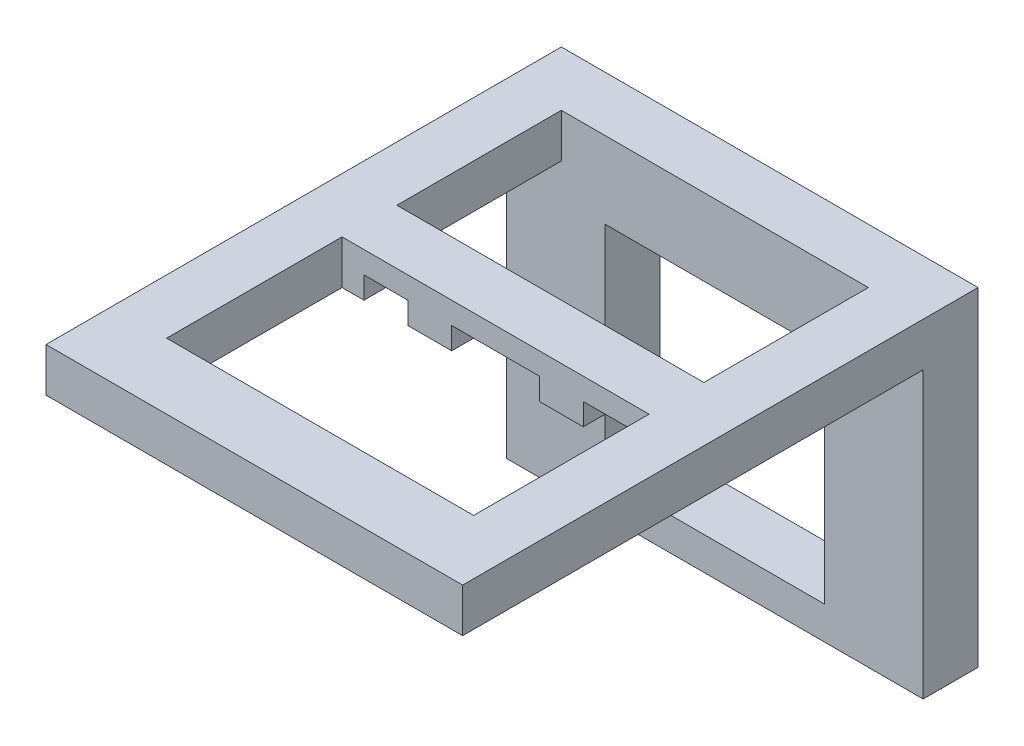
ISO-10303-21;
HEADER;
FILE_DESCRIPTION(('STEP AP214'),'2;1');
FILE_NAME('part.step','',(''),(''),'','','');
FILE_SCHEMA(('AUTOMOTIVE_DESIGN { 1 0 10303 214 1 1 1 1 }'));
ENDSEC;
DATA;
#1=APPLICATION_CONTEXT('core data for automotive mechanical design processes');
#2=APPLICATION_PROTOCOL_DEFINITION('international standard','automotive_design',2000,#1);
#3=PRODUCT_CONTEXT('',#1,'mechanical');
#4=PRODUCT('Part','Part','',(#3));
#5=PRODUCT_RELATED_PRODUCT_CATEGORY('part','',(#4));
#6=PRODUCT_DEFINITION_FORMATION('','',#4);
#7=PRODUCT_DEFINITION_CONTEXT('part definition',#1,'design');
#8=PRODUCT_DEFINITION('design','',#6,#7);
#9=PRODUCT_DEFINITION_SHAPE('','',#8);
#10=(LENGTH_UNIT() NAMED_UNIT(*) SI_UNIT(.MILLI.,.METRE.));
#11=(NAMED_UNIT(*) PLANE_ANGLE_UNIT() SI_UNIT($,.RADIAN.));
#12=(NAMED_UNIT(*) SI_UNIT($,.STERADIAN.) SOLID_ANGLE_UNIT());
#13=UNCERTAINTY_MEASURE_WITH_UNIT(LENGTH_MEASURE(1.E-05),#10,'distance_accuracy_value','');
#14=(GEOMETRIC_REPRESENTATION_CONTEXT(3) GLOBAL_UNCERTAINTY_ASSIGNED_CONTEXT((#13)) GLOBAL_UNIT_ASSIGNED_CONTEXT((#10,
#11,#12)) REPRESENTATION_CONTEXT('',''));
#15=CARTESIAN_POINT('',(0.,0.,0.));
#16=DIRECTION('',(0.,0.,1.));
#17=DIRECTION('',(1.,0.,0.));
#18=AXIS2_PLACEMENT_3D('',#15,#16,#17);
#19=CARTESIAN_POINT('',(0.,11.102908894462,12.5));
#20=DIRECTION('',(0.,0.,1.));
#21=DIRECTION('',(1.,0.,0.));
#22=AXIS2_PLACEMENT_3D('',#19,#20,#21);
#23=PLANE('',#22);
#24=DIRECTION('',(-1.,0.,0.));
#25=VECTOR('',#24,1.);
#26=CARTESIAN_POINT('',(-6.,10.102908894462,12.5));
#27=LINE('',#26,#25);
#28=CARTESIAN_POINT('',(-4.,10.102908894462,12.5));
#29=VERTEX_POINT('',#28);
#30=CARTESIAN_POINT('',(-6.,10.102908894462,12.5));
#31=VERTEX_POINT('',#30);
#32=EDGE_CURVE('E451',#29,#31,#27,.T.);
#33=ORIENTED_EDGE('',*,*,#32,.F.);
#34=DIRECTION('',(0.,1.,0.));
#35=VECTOR('',#34,1.);
#36=CARTESIAN_POINT('',(-4.,10.102908894462,12.5));
#37=LINE('',#36,#35);
#38=CARTESIAN_POINT('',(-4.,9.10290889446199,12.5));
#39=VERTEX_POINT('',#38);
#40=EDGE_CURVE('E908',#39,#29,#37,.T.);
#41=ORIENTED_EDGE('',*,*,#40,.F.);
#42=DIRECTION('',(-1.,0.,0.));
#43=VECTOR('',#42,1.);
#44=CARTESIAN_POINT('',(0.,9.10290889446198,12.5));
#45=LINE('',#44,#43);
#46=CARTESIAN_POINT('',(-2.,9.10290889446198,12.5));
#47=VERTEX_POINT('',#46);
#48=EDGE_CURVE('E262',#47,#39,#45,.T.);
#49=ORIENTED_EDGE('',*,*,#48,.F.);
#50=DIRECTION('',(0.,-1.,0.));
#51=VECTOR('',#50,1.);
#52=CARTESIAN_POINT('',(-2.,10.102908894462,12.5));
#53=LINE('',#52,#51);
#54=CARTESIAN_POINT('',(-2.,10.102908894462,12.5));
#55=VERTEX_POINT('',#54);
#56=EDGE_CURVE('E69',#55,#47,#53,.T.);
#57=ORIENTED_EDGE('',*,*,#56,.F.);
#58=DIRECTION('',(-1.,0.,0.));
#59=VECTOR('',#58,1.);
#60=CARTESIAN_POINT('',(-2.,10.102908894462,12.5));
#61=LINE('',#60,#59);
#62=CARTESIAN_POINT('',(2.,10.102908894462,12.5));
#63=VERTEX_POINT('',#62);
#64=EDGE_CURVE('E472',#63,#55,#61,.T.);
#65=ORIENTED_EDGE('',*,*,#64,.F.);
#66=DIRECTION('',(0.,1.,0.));
#67=VECTOR('',#66,1.);
#68=CARTESIAN_POINT('',(2.,10.102908894462,12.5));
#69=LINE('',#68,#67);
#70=CARTESIAN_POINT('',(2.,9.10290889446199,12.5));
#71=VERTEX_POINT('',#70);
#72=EDGE_CURVE('E511',#71,#63,#69,.T.);
#73=ORIENTED_EDGE('',*,*,#72,.F.);
#74=CARTESIAN_POINT('',(4.,9.10290889446198,12.5));
#75=VERTEX_POINT('',#74);
#76=EDGE_CURVE('E294',#75,#71,#45,.T.);
#77=ORIENTED_EDGE('',*,*,#76,.F.);
#78=DIRECTION('',(0.,-1.,0.));
#79=VECTOR('',#78,1.);
#80=CARTESIAN_POINT('',(4.,10.102908894462,12.5));
#81=LINE('',#80,#79);
#82=CARTESIAN_POINT('',(4.,10.102908894462,12.5));
#83=VERTEX_POINT('',#82);
#84=EDGE_CURVE('E480',#83,#75,#81,.T.);
#85=ORIENTED_EDGE('',*,*,#84,.F.);
#86=DIRECTION('',(-1.,0.,0.));
#87=VECTOR('',#86,1.);
#88=CARTESIAN_POINT('',(4.,10.102908894462,12.5));
#89=LINE('',#88,#87);
#90=CARTESIAN_POINT('',(6.,10.102908894462,12.5));
#91=VERTEX_POINT('',#90);
#92=EDGE_CURVE('E254',#91,#83,#89,.T.);
#93=ORIENTED_EDGE('',*,*,#92,.F.);
#94=DIRECTION('',(0.,1.,0.));
#95=VECTOR('',#94,1.);
#96=CARTESIAN_POINT('',(6.,10.102908894462,12.5));
#97=LINE('',#96,#95);
#98=CARTESIAN_POINT('',(6.,9.10290889446199,12.5));
#99=VERTEX_POINT('',#98);
#100=EDGE_CURVE('E476',#99,#91,#97,.T.);
#101=ORIENTED_EDGE('',*,*,#100,.F.);
#102=CARTESIAN_POINT('',(7.,9.10290889446198,12.5));
#103=VERTEX_POINT('',#102);
#104=EDGE_CURVE('E289',#103,#99,#45,.T.);
#105=ORIENTED_EDGE('',*,*,#104,.F.);
#106=DIRECTION('',(0.,-1.,0.));
#107=VECTOR('',#106,1.);
#108=CARTESIAN_POINT('',(7.,11.102908894462,12.5));
#109=LINE('',#108,#107);
#110=CARTESIAN_POINT('',(7.,11.102908894462,12.5));
#111=VERTEX_POINT('',#110);
#112=EDGE_CURVE('E331',#111,#103,#109,.T.);
#113=ORIENTED_EDGE('',*,*,#112,.F.);
#114=DIRECTION('',(-1.,0.,0.));
#115=VECTOR('',#114,1.);
#116=CARTESIAN_POINT('',(0.,11.102908894462,12.5));
#117=LINE('',#116,#115);
#118=CARTESIAN_POINT('',(-7.,11.102908894462,12.5));
#119=VERTEX_POINT('',#118);
#120=EDGE_CURVE('E554',#111,#119,#117,.T.);
#121=ORIENTED_EDGE('',*,*,#120,.T.);
#122=DIRECTION('',(0.,-1.,0.));
#123=VECTOR('',#122,1.);
#124=CARTESIAN_POINT('',(-7.,11.102908894462,12.5));
#125=LINE('',#124,#123);
#126=CARTESIAN_POINT('',(-7.,9.10290889446198,12.5));
#127=VERTEX_POINT('',#126);
#128=EDGE_CURVE('E318',#119,#127,#125,.T.);
#129=ORIENTED_EDGE('',*,*,#128,.T.);
#130=CARTESIAN_POINT('',(-6.,9.10290889446198,12.5));
#131=VERTEX_POINT('',#130);
#132=EDGE_CURVE('E288',#131,#127,#45,.T.);
#133=ORIENTED_EDGE('',*,*,#132,.F.);
#134=DIRECTION('',(0.,-1.,0.));
#135=VECTOR('',#134,1.);
#136=CARTESIAN_POINT('',(-6.,10.102908894462,12.5));
#137=LINE('',#136,#135);
#138=EDGE_CURVE('E61',#31,#131,#137,.T.);
#139=ORIENTED_EDGE('',*,*,#138,.F.);
#140=EDGE_LOOP('',(#33,#41,#49,#57,#65,#73,#77,#85,#93,#101,#105,#113,#121,#129,#133,#139));
#141=FACE_BOUND('',#140,.T.);
#142=ADVANCED_FACE('F43',(#141),#23,.T.);
#143=CARTESIAN_POINT('',(0.,11.102908894462,10.));
#144=DIRECTION('',(0.,0.,1.));
#145=DIRECTION('',(1.,0.,0.));
#146=AXIS2_PLACEMENT_3D('',#143,#144,#145);
#147=PLANE('',#146);
#148=DIRECTION('',(0.,1.,0.));
#149=VECTOR('',#148,1.);
#150=CARTESIAN_POINT('',(-4.,10.102908894462,10.));
#151=LINE('',#150,#149);
#152=CARTESIAN_POINT('',(-4.,9.10290889446198,10.));
#153=VERTEX_POINT('',#152);
#154=CARTESIAN_POINT('',(-4.,10.102908894462,10.));
#155=VERTEX_POINT('',#154);
#156=EDGE_CURVE('E242',#153,#155,#151,.T.);
#157=ORIENTED_EDGE('',*,*,#156,.T.);
#158=DIRECTION('',(-1.,0.,0.));
#159=VECTOR('',#158,1.);
#160=CARTESIAN_POINT('',(-6.,10.102908894462,10.));
#161=LINE('',#160,#159);
#162=CARTESIAN_POINT('',(-6.,10.102908894462,10.));
#163=VERTEX_POINT('',#162);
#164=EDGE_CURVE('E458',#155,#163,#161,.T.);
#165=ORIENTED_EDGE('',*,*,#164,.T.);
#166=DIRECTION('',(0.,-1.,0.));
#167=VECTOR('',#166,1.);
#168=CARTESIAN_POINT('',(-6.,10.102908894462,10.));
#169=LINE('',#168,#167);
#170=CARTESIAN_POINT('',(-6.,9.10290889446198,10.));
#171=VERTEX_POINT('',#170);
#172=EDGE_CURVE('E253',#163,#171,#169,.T.);
#173=ORIENTED_EDGE('',*,*,#172,.T.);
#174=DIRECTION('',(-1.,0.,0.));
#175=VECTOR('',#174,1.);
#176=CARTESIAN_POINT('',(0.,9.10290889446198,10.));
#177=LINE('',#176,#175);
#178=CARTESIAN_POINT('',(-7.,9.10290889446198,10.));
#179=VERTEX_POINT('',#178);
#180=EDGE_CURVE('E272',#171,#179,#177,.T.);
#181=ORIENTED_EDGE('',*,*,#180,.T.);
#182=DIRECTION('',(0.,-1.,0.));
#183=VECTOR('',#182,1.);
#184=CARTESIAN_POINT('',(-7.,11.102908894462,10.));
#185=LINE('',#184,#183);
#186=CARTESIAN_POINT('',(-7.,11.102908894462,10.));
#187=VERTEX_POINT('',#186);
#188=EDGE_CURVE('E337',#187,#179,#185,.T.);
#189=ORIENTED_EDGE('',*,*,#188,.F.);
#190=DIRECTION('',(-1.,0.,0.));
#191=VECTOR('',#190,1.);
#192=CARTESIAN_POINT('',(0.,11.102908894462,10.));
#193=LINE('',#192,#191);
#194=CARTESIAN_POINT('',(7.,11.102908894462,10.));
#195=VERTEX_POINT('',#194);
#196=EDGE_CURVE('E547',#195,#187,#193,.T.);
#197=ORIENTED_EDGE('',*,*,#196,.F.);
#198=DIRECTION('',(0.,-1.,0.));
#199=VECTOR('',#198,1.);
#200=CARTESIAN_POINT('',(7.,11.102908894462,10.));
#201=LINE('',#200,#199);
#202=CARTESIAN_POINT('',(7.,9.10290889446198,10.));
#203=VERTEX_POINT('',#202);
#204=EDGE_CURVE('E341',#195,#203,#201,.T.);
#205=ORIENTED_EDGE('',*,*,#204,.T.);
#206=CARTESIAN_POINT('',(6.,9.10290889446198,10.));
#207=VERTEX_POINT('',#206);
#208=EDGE_CURVE('E277',#203,#207,#177,.T.);
#209=ORIENTED_EDGE('',*,*,#208,.T.);
#210=DIRECTION('',(0.,1.,0.));
#211=VECTOR('',#210,1.);
#212=CARTESIAN_POINT('',(6.,10.102908894462,10.));
#213=LINE('',#212,#211);
#214=CARTESIAN_POINT('',(6.,10.102908894462,10.));
#215=VERTEX_POINT('',#214);
#216=EDGE_CURVE('E467',#207,#215,#213,.T.);
#217=ORIENTED_EDGE('',*,*,#216,.T.);
#218=DIRECTION('',(-1.,0.,0.));
#219=VECTOR('',#218,1.);
#220=CARTESIAN_POINT('',(4.,10.102908894462,10.));
#221=LINE('',#220,#219);
#222=CARTESIAN_POINT('',(4.,10.102908894462,10.));
#223=VERTEX_POINT('',#222);
#224=EDGE_CURVE('E498',#215,#223,#221,.T.);
#225=ORIENTED_EDGE('',*,*,#224,.T.);
#226=DIRECTION('',(0.,-1.,0.));
#227=VECTOR('',#226,1.);
#228=CARTESIAN_POINT('',(4.,10.102908894462,10.));
#229=LINE('',#228,#227);
#230=CARTESIAN_POINT('',(4.,9.10290889446198,10.));
#231=VERTEX_POINT('',#230);
#232=EDGE_CURVE('E471',#223,#231,#229,.T.);
#233=ORIENTED_EDGE('',*,*,#232,.T.);
#234=CARTESIAN_POINT('',(2.,9.10290889446198,10.));
#235=VERTEX_POINT('',#234);
#236=EDGE_CURVE('E271',#231,#235,#177,.T.);
#237=ORIENTED_EDGE('',*,*,#236,.T.);
#238=DIRECTION('',(0.,1.,0.));
#239=VECTOR('',#238,1.);
#240=CARTESIAN_POINT('',(2.,10.102908894462,10.));
#241=LINE('',#240,#239);
#242=CARTESIAN_POINT('',(2.,10.102908894462,10.));
#243=VERTEX_POINT('',#242);
#244=EDGE_CURVE('E505',#235,#243,#241,.T.);
#245=ORIENTED_EDGE('',*,*,#244,.T.);
#246=DIRECTION('',(-1.,0.,0.));
#247=VECTOR('',#246,1.);
#248=CARTESIAN_POINT('',(-2.,10.102908894462,10.));
#249=LINE('',#248,#247);
#250=CARTESIAN_POINT('',(-2.,10.102908894462,10.));
#251=VERTEX_POINT('',#250);
#252=EDGE_CURVE('E532',#243,#251,#249,.T.);
#253=ORIENTED_EDGE('',*,*,#252,.T.);
#254=DIRECTION('',(0.,-1.,0.));
#255=VECTOR('',#254,1.);
#256=CARTESIAN_POINT('',(-2.,10.102908894462,10.));
#257=LINE('',#256,#255);
#258=CARTESIAN_POINT('',(-2.,9.10290889446198,10.));
#259=VERTEX_POINT('',#258);
#260=EDGE_CURVE('E269',#251,#259,#257,.T.);
#261=ORIENTED_EDGE('',*,*,#260,.T.);
#262=EDGE_CURVE('E260',#259,#153,#177,.T.);
#263=ORIENTED_EDGE('',*,*,#262,.T.);
#264=EDGE_LOOP('',(#157,#165,#173,#181,#189,#197,#205,#209,#217,#225,#233,#237,#245,#253,#261,#263));
#265=FACE_BOUND('',#264,.T.);
#266=ADVANCED_FACE('F267',(#265),#147,.F.);
#267=CARTESIAN_POINT('',(0.,9.10290889446198,0.));
#268=DIRECTION('',(0.,1.,0.));
#269=DIRECTION('',(-1.,0.,0.));
#270=AXIS2_PLACEMENT_3D('',#267,#268,#269);
#271=PLANE('',#270);
#272=DIRECTION('',(0.,0.,-1.));
#273=VECTOR('',#272,1.);
#274=CARTESIAN_POINT('',(-4.,9.10290889446199,23.501));
#275=LINE('',#274,#273);
#276=EDGE_CURVE('E246',#39,#153,#275,.T.);
#277=ORIENTED_EDGE('',*,*,#276,.T.);
#278=ORIENTED_EDGE('',*,*,#262,.F.);
#279=DIRECTION('',(0.,0.,-1.));
#280=VECTOR('',#279,1.);
#281=CARTESIAN_POINT('',(-2.,9.10290889446199,23.501));
#282=LINE('',#281,#280);
#283=EDGE_CURVE('E529',#47,#259,#282,.T.);
#284=ORIENTED_EDGE('',*,*,#283,.F.);
#285=ORIENTED_EDGE('',*,*,#48,.T.);
#286=EDGE_LOOP('',(#277,#278,#284,#285));
#287=FACE_BOUND('',#286,.T.);
#288=ADVANCED_FACE('F259',(#287),#271,.F.);
#289=DIRECTION('',(0.,0.,-1.));
#290=VECTOR('',#289,1.);
#291=CARTESIAN_POINT('',(-6.,9.10290889446199,23.501));
#292=LINE('',#291,#290);
#293=EDGE_CURVE('E264',#131,#171,#292,.T.);
#294=ORIENTED_EDGE('',*,*,#293,.F.);
#295=ORIENTED_EDGE('',*,*,#132,.T.);
#296=DIRECTION('',(0.,0.,1.));
#297=VECTOR('',#296,1.);
#298=CARTESIAN_POINT('',(-7.,9.10290889446198,0.));
#299=LINE('',#298,#297);
#300=CARTESIAN_POINT('',(-7.,9.10290889446198,20.5));
#301=VERTEX_POINT('',#300);
#302=EDGE_CURVE('E283',#127,#301,#299,.T.);
#303=ORIENTED_EDGE('',*,*,#302,.T.);
#304=DIRECTION('',(-1.,0.,0.));
#305=VECTOR('',#304,1.);
#306=CARTESIAN_POINT('',(0.,9.10290889446198,20.5));
#307=LINE('',#306,#305);
#308=CARTESIAN_POINT('',(7.,9.10290889446198,20.5));
#309=VERTEX_POINT('',#308);
#310=EDGE_CURVE('E298',#309,#301,#307,.T.);
#311=ORIENTED_EDGE('',*,*,#310,.F.);
#312=DIRECTION('',(0.,0.,1.));
#313=VECTOR('',#312,1.);
#314=CARTESIAN_POINT('',(7.,9.10290889446198,0.));
#315=LINE('',#314,#313);
#316=EDGE_CURVE('E293',#103,#309,#315,.T.);
#317=ORIENTED_EDGE('',*,*,#316,.F.);
#318=ORIENTED_EDGE('',*,*,#104,.T.);
#319=DIRECTION('',(0.,0.,-1.));
#320=VECTOR('',#319,1.);
#321=CARTESIAN_POINT('',(6.,9.10290889446199,23.501));
#322=LINE('',#321,#320);
#323=EDGE_CURVE('E491',#99,#207,#322,.T.);
#324=ORIENTED_EDGE('',*,*,#323,.T.);
#325=ORIENTED_EDGE('',*,*,#208,.F.);
#326=DIRECTION('',(0.,0.,1.));
#327=VECTOR('',#326,1.);
#328=CARTESIAN_POINT('',(7.,9.10290889446198,0.));
#329=LINE('',#328,#327);
#330=CARTESIAN_POINT('',(7.,9.10290889446198,2.5));
#331=VERTEX_POINT('',#330);
#332=EDGE_CURVE('E278',#331,#203,#329,.T.);
#333=ORIENTED_EDGE('',*,*,#332,.F.);
#334=DIRECTION('',(-1.,0.,0.));
#335=VECTOR('',#334,1.);
#336=CARTESIAN_POINT('',(0.,9.10290889446198,2.5));
#337=LINE('',#336,#335);
#338=CARTESIAN_POINT('',(9.5,9.10290889446198,2.5));
#339=VERTEX_POINT('',#338);
#340=EDGE_CURVE('E358',#339,#331,#337,.T.);
#341=ORIENTED_EDGE('',*,*,#340,.F.);
#342=DIRECTION('',(0.,0.,-1.));
#343=VECTOR('',#342,1.);
#344=CARTESIAN_POINT('',(9.5,9.10290889446198,0.));
#345=LINE('',#344,#343);
#346=CARTESIAN_POINT('',(9.5,9.10290889446198,23.5));
#347=VERTEX_POINT('',#346);
#348=EDGE_CURVE('E309',#347,#339,#345,.T.);
#349=ORIENTED_EDGE('',*,*,#348,.F.);
#350=DIRECTION('',(-1.,0.,0.));
#351=VECTOR('',#350,1.);
#352=CARTESIAN_POINT('',(0.,9.10290889446198,23.5));
#353=LINE('',#352,#351);
#354=CARTESIAN_POINT('',(-9.5,9.10290889446198,23.5));
#355=VERTEX_POINT('',#354);
#356=EDGE_CURVE('E305',#347,#355,#353,.T.);
#357=ORIENTED_EDGE('',*,*,#356,.T.);
#358=DIRECTION('',(0.,0.,1.));
#359=VECTOR('',#358,1.);
#360=CARTESIAN_POINT('',(-9.5,9.10290889446198,0.));
#361=LINE('',#360,#359);
#362=CARTESIAN_POINT('',(-9.5,9.10290889446198,2.5));
#363=VERTEX_POINT('',#362);
#364=EDGE_CURVE('E302',#363,#355,#361,.T.);
#365=ORIENTED_EDGE('',*,*,#364,.F.);
#366=CARTESIAN_POINT('',(-7.,9.10290889446198,2.5));
#367=VERTEX_POINT('',#366);
#368=EDGE_CURVE('E356',#367,#363,#337,.T.);
#369=ORIENTED_EDGE('',*,*,#368,.F.);
#370=DIRECTION('',(0.,0.,1.));
#371=VECTOR('',#370,1.);
#372=CARTESIAN_POINT('',(-7.,9.10290889446198,0.));
#373=LINE('',#372,#371);
#374=EDGE_CURVE('E448',#367,#179,#373,.T.);
#375=ORIENTED_EDGE('',*,*,#374,.T.);
#376=ORIENTED_EDGE('',*,*,#180,.F.);
#377=EDGE_LOOP('',(#294,#295,#303,#311,#317,#318,#324,#325,#333,#341,#349,#357,#365,#369,#375,#376));
#378=FACE_BOUND('',#377,.T.);
#379=ADVANCED_FACE('F572',(#378),#271,.F.);
#380=DIRECTION('',(0.,0.,-1.));
#381=VECTOR('',#380,1.);
#382=CARTESIAN_POINT('',(4.,9.10290889446199,23.501));
#383=LINE('',#382,#381);
#384=EDGE_CURVE('E495',#75,#231,#383,.T.);
#385=ORIENTED_EDGE('',*,*,#384,.F.);
#386=ORIENTED_EDGE('',*,*,#76,.T.);
#387=DIRECTION('',(0.,0.,-1.));
#388=VECTOR('',#387,1.);
#389=CARTESIAN_POINT('',(2.,9.10290889446199,23.501));
#390=LINE('',#389,#388);
#391=EDGE_CURVE('E525',#71,#235,#390,.T.);
#392=ORIENTED_EDGE('',*,*,#391,.T.);
#393=ORIENTED_EDGE('',*,*,#236,.F.);
#394=EDGE_LOOP('',(#385,#386,#392,#393));
#395=FACE_BOUND('',#394,.T.);
#396=ADVANCED_FACE('F600',(#395),#271,.F.);
#397=CARTESIAN_POINT('',(0.,7.60290889446198,2.5));
#398=DIRECTION('',(0.,1.,0.));
#399=DIRECTION('',(0.,0.,1.));
#400=AXIS2_PLACEMENT_3D('',#397,#398,#399);
#401=PLANE('',#400);
#402=DIRECTION('',(1.,0.,0.));
#403=VECTOR('',#402,1.);
#404=CARTESIAN_POINT('',(0.,7.60290889446198,0.));
#405=LINE('',#404,#403);
#406=CARTESIAN_POINT('',(-5.,7.60290889446198,0.));
#407=VERTEX_POINT('',#406);
#408=CARTESIAN_POINT('',(5.,7.60290889446198,0.));
#409=VERTEX_POINT('',#408);
#410=EDGE_CURVE('E394',#407,#409,#405,.T.);
#411=ORIENTED_EDGE('',*,*,#410,.T.);
#412=DIRECTION('',(0.,0.,-1.));
#413=VECTOR('',#412,1.);
#414=CARTESIAN_POINT('',(5.,7.60290889446198,2.5));
#415=LINE('',#414,#413);
#416=CARTESIAN_POINT('',(5.,7.60290889446198,2.5));
#417=VERTEX_POINT('',#416);
#418=EDGE_CURVE('E11',#417,#409,#415,.T.);
#419=ORIENTED_EDGE('',*,*,#418,.F.);
#420=DIRECTION('',(1.,0.,0.));
#421=VECTOR('',#420,1.);
#422=CARTESIAN_POINT('',(0.,7.60290889446198,2.5));
#423=LINE('',#422,#421);
#424=CARTESIAN_POINT('',(-5.,7.60290889446198,2.5));
#425=VERTEX_POINT('',#424);
#426=EDGE_CURVE('E369',#425,#417,#423,.T.);
#427=ORIENTED_EDGE('',*,*,#426,.F.);
#428=DIRECTION('',(0.,0.,-1.));
#429=VECTOR('',#428,1.);
#430=CARTESIAN_POINT('',(-5.,7.60290889446198,2.5));
#431=LINE('',#430,#429);
#432=EDGE_CURVE('E407',#425,#407,#431,.T.);
#433=ORIENTED_EDGE('',*,*,#432,.T.);
#434=EDGE_LOOP('',(#411,#419,#427,#433));
#435=FACE_BOUND('',#434,.T.);
#436=ADVANCED_FACE('F668',(#435),#401,.F.);
#437=CARTESIAN_POINT('',(5.,0.,2.5));
#438=DIRECTION('',(-1.,0.,0.));
#439=DIRECTION('',(0.,0.,1.));
#440=AXIS2_PLACEMENT_3D('',#437,#438,#439);
#441=PLANE('',#440);
#442=DIRECTION('',(0.,1.,0.));
#443=VECTOR('',#442,1.);
#444=CARTESIAN_POINT('',(5.,0.,0.));
#445=LINE('',#444,#443);
#446=CARTESIAN_POINT('',(5.,-2.39709110553801,0.));
#447=VERTEX_POINT('',#446);
#448=EDGE_CURVE('E398',#447,#409,#445,.T.);
#449=ORIENTED_EDGE('',*,*,#448,.F.);
#450=DIRECTION('',(0.,0.,-1.));
#451=VECTOR('',#450,1.);
#452=CARTESIAN_POINT('',(5.,-2.39709110553801,2.5));
#453=LINE('',#452,#451);
#454=CARTESIAN_POINT('',(5.,-2.39709110553801,2.5));
#455=VERTEX_POINT('',#454);
#456=EDGE_CURVE('E53',#455,#447,#453,.T.);
#457=ORIENTED_EDGE('',*,*,#456,.F.);
#458=DIRECTION('',(0.,1.,0.));
#459=VECTOR('',#458,1.);
#460=CARTESIAN_POINT('',(5.,0.,2.5));
#461=LINE('',#460,#459);
#462=EDGE_CURVE('E372',#455,#417,#461,.T.);
#463=ORIENTED_EDGE('',*,*,#462,.T.);
#464=ORIENTED_EDGE('',*,*,#418,.T.);
#465=EDGE_LOOP('',(#449,#457,#463,#464));
#466=FACE_BOUND('',#465,.T.);
#467=ADVANCED_FACE('F664',(#466),#441,.T.);
#468=CARTESIAN_POINT('',(0.,-2.39709110553801,2.5));
#469=DIRECTION('',(0.,-1.,0.));
#470=DIRECTION('',(1.,0.,0.));
#471=AXIS2_PLACEMENT_3D('',#468,#469,#470);
#472=PLANE('',#471);
#473=DIRECTION('',(-1.,0.,0.));
#474=VECTOR('',#473,1.);
#475=CARTESIAN_POINT('',(0.,-2.39709110553801,0.));
#476=LINE('',#475,#474);
#477=CARTESIAN_POINT('',(-5.,-2.39709110553802,0.));
#478=VERTEX_POINT('',#477);
#479=EDGE_CURVE('E402',#447,#478,#476,.T.);
#480=ORIENTED_EDGE('',*,*,#479,.T.);
#481=DIRECTION('',(0.,0.,-1.));
#482=VECTOR('',#481,1.);
#483=CARTESIAN_POINT('',(-5.,-2.39709110553802,2.5));
#484=LINE('',#483,#482);
#485=CARTESIAN_POINT('',(-5.,-2.39709110553802,2.5));
#486=VERTEX_POINT('',#485);
#487=EDGE_CURVE('E411',#486,#478,#484,.T.);
#488=ORIENTED_EDGE('',*,*,#487,.F.);
#489=DIRECTION('',(-1.,0.,0.));
#490=VECTOR('',#489,1.);
#491=CARTESIAN_POINT('',(0.,-2.39709110553801,2.5));
#492=LINE('',#491,#490);
#493=EDGE_CURVE('E376',#455,#486,#492,.T.);
#494=ORIENTED_EDGE('',*,*,#493,.F.);
#495=ORIENTED_EDGE('',*,*,#456,.T.);
#496=EDGE_LOOP('',(#480,#488,#494,#495));
#497=FACE_BOUND('',#496,.T.);
#498=ADVANCED_FACE('F661',(#497),#472,.F.);
#499=CARTESIAN_POINT('',(9.5,0.,2.5));
#500=DIRECTION('',(1.,0.,0.));
#501=DIRECTION('',(0.,1.,0.));
#502=AXIS2_PLACEMENT_3D('',#499,#500,#501);
#503=PLANE('',#502);
#504=DIRECTION('',(0.,-1.,0.));
#505=VECTOR('',#504,1.);
#506=CARTESIAN_POINT('',(9.5,0.,0.));
#507=LINE('',#506,#505);
#508=CARTESIAN_POINT('',(9.5,11.102908894462,0.));
#509=VERTEX_POINT('',#508);
#510=CARTESIAN_POINT('',(9.5,-3.89709110553801,0.));
#511=VERTEX_POINT('',#510);
#512=EDGE_CURVE('E322',#509,#511,#507,.T.);
#513=ORIENTED_EDGE('',*,*,#512,.F.);
#514=DIRECTION('',(0.,0.,-1.));
#515=VECTOR('',#514,1.);
#516=CARTESIAN_POINT('',(9.5,11.102908894462,0.));
#517=LINE('',#516,#515);
#518=CARTESIAN_POINT('',(9.5,11.102908894462,23.5));
#519=VERTEX_POINT('',#518);
#520=EDGE_CURVE('E342',#519,#509,#517,.T.);
#521=ORIENTED_EDGE('',*,*,#520,.F.);
#522=DIRECTION('',(0.,-1.,0.));
#523=VECTOR('',#522,1.);
#524=CARTESIAN_POINT('',(9.5,11.102908894462,23.5));
#525=LINE('',#524,#523);
#526=EDGE_CURVE('E314',#519,#347,#525,.T.);
#527=ORIENTED_EDGE('',*,*,#526,.T.);
#528=ORIENTED_EDGE('',*,*,#348,.T.);
#529=DIRECTION('',(0.,-1.,0.));
#530=VECTOR('',#529,1.);
#531=CARTESIAN_POINT('',(9.5,0.,2.5));
#532=LINE('',#531,#530);
#533=CARTESIAN_POINT('',(9.5,-3.89709110553801,2.5));
#534=VERTEX_POINT('',#533);
#535=EDGE_CURVE('E352',#339,#534,#532,.T.);
#536=ORIENTED_EDGE('',*,*,#535,.T.);
#537=DIRECTION('',(0.,0.,-1.));
#538=VECTOR('',#537,1.);
#539=CARTESIAN_POINT('',(9.5,-3.89709110553801,2.5));
#540=LINE('',#539,#538);
#541=EDGE_CURVE('E382',#534,#511,#540,.T.);
#542=ORIENTED_EDGE('',*,*,#541,.T.);
#543=EDGE_LOOP('',(#513,#521,#527,#528,#536,#542));
#544=FACE_BOUND('',#543,.T.);
#545=ADVANCED_FACE('F45',(#544),#503,.T.);
#546=CARTESIAN_POINT('',(-9.5,0.,2.5));
#547=DIRECTION('',(1.,0.,0.));
#548=DIRECTION('',(0.,1.,0.));
#549=AXIS2_PLACEMENT_3D('',#546,#547,#548);
#550=PLANE('',#549);
#551=DIRECTION('',(0.,-1.,0.));
#552=VECTOR('',#551,1.);
#553=CARTESIAN_POINT('',(-9.5,0.,0.));
#554=LINE('',#553,#552);
#555=CARTESIAN_POINT('',(-9.5,11.102908894462,0.));
#556=VERTEX_POINT('',#555);
#557=CARTESIAN_POINT('',(-9.5,-3.89709110553802,0.));
#558=VERTEX_POINT('',#557);
#559=EDGE_CURVE('E386',#556,#558,#554,.T.);
#560=ORIENTED_EDGE('',*,*,#559,.T.);
#561=DIRECTION('',(0.,0.,-1.));
#562=VECTOR('',#561,1.);
#563=CARTESIAN_POINT('',(-9.5,-3.89709110553802,2.5));
#564=LINE('',#563,#562);
#565=CARTESIAN_POINT('',(-9.5,-3.89709110553802,2.5));
#566=VERTEX_POINT('',#565);
#567=EDGE_CURVE('E47',#566,#558,#564,.T.);
#568=ORIENTED_EDGE('',*,*,#567,.F.);
#569=DIRECTION('',(0.,-1.,0.));
#570=VECTOR('',#569,1.);
#571=CARTESIAN_POINT('',(-9.5,0.,2.5));
#572=LINE('',#571,#570);
#573=EDGE_CURVE('E362',#363,#566,#572,.T.);
#574=ORIENTED_EDGE('',*,*,#573,.F.);
#575=ORIENTED_EDGE('',*,*,#364,.T.);
#576=DIRECTION('',(0.,-1.,0.));
#577=VECTOR('',#576,1.);
#578=CARTESIAN_POINT('',(-9.5,11.102908894462,23.5));
#579=LINE('',#578,#577);
#580=CARTESIAN_POINT('',(-9.5,11.102908894462,23.5));
#581=VERTEX_POINT('',#580);
#582=EDGE_CURVE('E317',#581,#355,#579,.T.);
#583=ORIENTED_EDGE('',*,*,#582,.F.);
#584=DIRECTION('',(0.,0.,1.));
#585=VECTOR('',#584,1.);
#586=CARTESIAN_POINT('',(-9.5,11.102908894462,0.));
#587=LINE('',#586,#585);
#588=EDGE_CURVE('E429',#556,#581,#587,.T.);
#589=ORIENTED_EDGE('',*,*,#588,.F.);
#590=EDGE_LOOP('',(#560,#568,#574,#575,#583,#589));
#591=FACE_BOUND('',#590,.T.);
#592=ADVANCED_FACE('F427',(#591),#550,.F.);
#593=CARTESIAN_POINT('',(0.,-3.89709110553802,2.5));
#594=DIRECTION('',(0.,-1.,0.));
#595=DIRECTION('',(1.,0.,0.));
#596=AXIS2_PLACEMENT_3D('',#593,#594,#595);
#597=PLANE('',#596);
#598=DIRECTION('',(-1.,0.,0.));
#599=VECTOR('',#598,1.);
#600=CARTESIAN_POINT('',(0.,-3.89709110553802,0.));
#601=LINE('',#600,#599);
#602=EDGE_CURVE('E390',#511,#558,#601,.T.);
#603=ORIENTED_EDGE('',*,*,#602,.F.);
#604=ORIENTED_EDGE('',*,*,#541,.F.);
#605=DIRECTION('',(-1.,0.,0.));
#606=VECTOR('',#605,1.);
#607=CARTESIAN_POINT('',(0.,-3.89709110553802,2.5));
#608=LINE('',#607,#606);
#609=EDGE_CURVE('E365',#534,#566,#608,.T.);
#610=ORIENTED_EDGE('',*,*,#609,.T.);
#611=ORIENTED_EDGE('',*,*,#567,.T.);
#612=EDGE_LOOP('',(#603,#604,#610,#611));
#613=FACE_BOUND('',#612,.T.);
#614=ADVANCED_FACE('F422',(#613),#597,.T.);
#615=CARTESIAN_POINT('',(-5.,0.,2.5));
#616=DIRECTION('',(-1.,0.,0.));
#617=DIRECTION('',(0.,-1.,0.));
#618=AXIS2_PLACEMENT_3D('',#615,#616,#617);
#619=PLANE('',#618);
#620=DIRECTION('',(0.,1.,0.));
#621=VECTOR('',#620,1.);
#622=CARTESIAN_POINT('',(-5.,0.,0.));
#623=LINE('',#622,#621);
#624=EDGE_CURVE('E357',#478,#407,#623,.T.);
#625=ORIENTED_EDGE('',*,*,#624,.T.);
#626=ORIENTED_EDGE('',*,*,#432,.F.);
#627=DIRECTION('',(0.,1.,0.));
#628=VECTOR('',#627,1.);
#629=CARTESIAN_POINT('',(-5.,0.,2.5));
#630=LINE('',#629,#628);
#631=EDGE_CURVE('E379',#486,#425,#630,.T.);
#632=ORIENTED_EDGE('',*,*,#631,.F.);
#633=ORIENTED_EDGE('',*,*,#487,.T.);
#634=EDGE_LOOP('',(#625,#626,#632,#633));
#635=FACE_BOUND('',#634,.T.);
#636=ADVANCED_FACE('F655',(#635),#619,.F.);
#637=CARTESIAN_POINT('',(0.,0.,2.5));
#638=DIRECTION('',(0.,0.,1.));
#639=DIRECTION('',(1.,0.,0.));
#640=AXIS2_PLACEMENT_3D('',#637,#638,#639);
#641=PLANE('',#640);
#642=ORIENTED_EDGE('',*,*,#535,.F.);
#643=ORIENTED_EDGE('',*,*,#340,.T.);
#644=DIRECTION('',(0.,-1.,0.));
#645=VECTOR('',#644,1.);
#646=CARTESIAN_POINT('',(7.,11.102908894462,2.5));
#647=LINE('',#646,#645);
#648=CARTESIAN_POINT('',(7.,11.102908894462,2.5));
#649=VERTEX_POINT('',#648);
#650=EDGE_CURVE('E346',#649,#331,#647,.T.);
#651=ORIENTED_EDGE('',*,*,#650,.F.);
#652=DIRECTION('',(1.,0.,0.));
#653=VECTOR('',#652,1.);
#654=CARTESIAN_POINT('',(0.,11.102908894462,2.5));
#655=LINE('',#654,#653);
#656=CARTESIAN_POINT('',(-7.,11.102908894462,2.5));
#657=VERTEX_POINT('',#656);
#658=EDGE_CURVE('E541',#657,#649,#655,.T.);
#659=ORIENTED_EDGE('',*,*,#658,.F.);
#660=DIRECTION('',(0.,-1.,0.));
#661=VECTOR('',#660,1.);
#662=CARTESIAN_POINT('',(-7.,11.102908894462,2.5));
#663=LINE('',#662,#661);
#664=EDGE_CURVE('E327',#657,#367,#663,.T.);
#665=ORIENTED_EDGE('',*,*,#664,.T.);
#666=ORIENTED_EDGE('',*,*,#368,.T.);
#667=ORIENTED_EDGE('',*,*,#573,.T.);
#668=ORIENTED_EDGE('',*,*,#609,.F.);
#669=EDGE_LOOP('',(#642,#643,#651,#659,#665,#666,#667,#668));
#670=FACE_BOUND('',#669,.T.);
#671=ORIENTED_EDGE('',*,*,#426,.T.);
#672=ORIENTED_EDGE('',*,*,#462,.F.);
#673=ORIENTED_EDGE('',*,*,#493,.T.);
#674=ORIENTED_EDGE('',*,*,#631,.T.);
#675=EDGE_LOOP('',(#671,#672,#673,#674));
#676=FACE_BOUND('',#675,.T.);
#677=ADVANCED_FACE('F577',(#670,#676),#641,.T.);
#678=CARTESIAN_POINT('',(0.,0.,0.));
#679=DIRECTION('',(0.,0.,1.));
#680=DIRECTION('',(1.,0.,0.));
#681=AXIS2_PLACEMENT_3D('',#678,#679,#680);
#682=PLANE('',#681);
#683=ORIENTED_EDGE('',*,*,#512,.T.);
#684=ORIENTED_EDGE('',*,*,#602,.T.);
#685=ORIENTED_EDGE('',*,*,#559,.F.);
#686=DIRECTION('',(-1.,0.,0.));
#687=VECTOR('',#686,1.);
#688=CARTESIAN_POINT('',(0.,11.102908894462,0.));
#689=LINE('',#688,#687);
#690=EDGE_CURVE('E435',#509,#556,#689,.T.);
#691=ORIENTED_EDGE('',*,*,#690,.F.);
#692=EDGE_LOOP('',(#683,#684,#685,#691));
#693=FACE_BOUND('',#692,.T.);
#694=ORIENTED_EDGE('',*,*,#410,.F.);
#695=ORIENTED_EDGE('',*,*,#624,.F.);
#696=ORIENTED_EDGE('',*,*,#479,.F.);
#697=ORIENTED_EDGE('',*,*,#448,.T.);
#698=EDGE_LOOP('',(#694,#695,#696,#697));
#699=FACE_BOUND('',#698,.T.);
#700=ADVANCED_FACE('F433',(#693,#699),#682,.F.);
#701=CARTESIAN_POINT('',(0.,11.102908894462,23.5));
#702=DIRECTION('',(0.,0.,1.));
#703=DIRECTION('',(1.,0.,0.));
#704=AXIS2_PLACEMENT_3D('',#701,#702,#703);
#705=PLANE('',#704);
#706=ORIENTED_EDGE('',*,*,#356,.F.);
#707=ORIENTED_EDGE('',*,*,#526,.F.);
#708=DIRECTION('',(-1.,0.,0.));
#709=VECTOR('',#708,1.);
#710=CARTESIAN_POINT('',(0.,11.102908894462,23.5));
#711=LINE('',#710,#709);
#712=EDGE_CURVE('E442',#519,#581,#711,.T.);
#713=ORIENTED_EDGE('',*,*,#712,.T.);
#714=ORIENTED_EDGE('',*,*,#582,.T.);
#715=EDGE_LOOP('',(#706,#707,#713,#714));
#716=FACE_BOUND('',#715,.T.);
#717=ADVANCED_FACE('F569',(#716),#705,.T.);
#718=CARTESIAN_POINT('',(-7.,11.102908894462,0.));
#719=DIRECTION('',(1.,0.,0.));
#720=DIRECTION('',(0.,1.,0.));
#721=AXIS2_PLACEMENT_3D('',#718,#719,#720);
#722=PLANE('',#721);
#723=ORIENTED_EDGE('',*,*,#302,.F.);
#724=ORIENTED_EDGE('',*,*,#128,.F.);
#725=DIRECTION('',(0.,0.,1.));
#726=VECTOR('',#725,1.);
#727=CARTESIAN_POINT('',(-7.,11.102908894462,0.));
#728=LINE('',#727,#726);
#729=CARTESIAN_POINT('',(-7.,11.102908894462,20.5));
#730=VERTEX_POINT('',#729);
#731=EDGE_CURVE('E550',#119,#730,#728,.T.);
#732=ORIENTED_EDGE('',*,*,#731,.T.);
#733=DIRECTION('',(0.,-1.,0.));
#734=VECTOR('',#733,1.);
#735=CARTESIAN_POINT('',(-7.,11.102908894462,20.5));
#736=LINE('',#735,#734);
#737=EDGE_CURVE('E323',#730,#301,#736,.T.);
#738=ORIENTED_EDGE('',*,*,#737,.T.);
#739=EDGE_LOOP('',(#723,#724,#732,#738));
#740=FACE_BOUND('',#739,.T.);
#741=ADVANCED_FACE('F625',(#740),#722,.T.);
#742=CARTESIAN_POINT('',(7.,11.102908894462,0.));
#743=DIRECTION('',(1.,0.,0.));
#744=DIRECTION('',(0.,1.,0.));
#745=AXIS2_PLACEMENT_3D('',#742,#743,#744);
#746=PLANE('',#745);
#747=ORIENTED_EDGE('',*,*,#316,.T.);
#748=DIRECTION('',(0.,-1.,0.));
#749=VECTOR('',#748,1.);
#750=CARTESIAN_POINT('',(7.,11.102908894462,20.5));
#751=LINE('',#750,#749);
#752=CARTESIAN_POINT('',(7.,11.102908894462,20.5));
#753=VERTEX_POINT('',#752);
#754=EDGE_CURVE('E326',#753,#309,#751,.T.);
#755=ORIENTED_EDGE('',*,*,#754,.F.);
#756=DIRECTION('',(0.,0.,1.));
#757=VECTOR('',#756,1.);
#758=CARTESIAN_POINT('',(7.,11.102908894462,0.));
#759=LINE('',#758,#757);
#760=EDGE_CURVE('E558',#111,#753,#759,.T.);
#761=ORIENTED_EDGE('',*,*,#760,.F.);
#762=ORIENTED_EDGE('',*,*,#112,.T.);
#763=EDGE_LOOP('',(#747,#755,#761,#762));
#764=FACE_BOUND('',#763,.T.);
#765=ADVANCED_FACE('F618',(#764),#746,.F.);
#766=CARTESIAN_POINT('',(-7.,11.102908894462,0.));
#767=DIRECTION('',(1.,0.,0.));
#768=DIRECTION('',(0.,1.,0.));
#769=AXIS2_PLACEMENT_3D('',#766,#767,#768);
#770=PLANE('',#769);
#771=ORIENTED_EDGE('',*,*,#374,.F.);
#772=ORIENTED_EDGE('',*,*,#664,.F.);
#773=DIRECTION('',(0.,0.,1.));
#774=VECTOR('',#773,1.);
#775=CARTESIAN_POINT('',(-7.,11.102908894462,0.));
#776=LINE('',#775,#774);
#777=EDGE_CURVE('E313',#657,#187,#776,.T.);
#778=ORIENTED_EDGE('',*,*,#777,.T.);
#779=ORIENTED_EDGE('',*,*,#188,.T.);
#780=EDGE_LOOP('',(#771,#772,#778,#779));
#781=FACE_BOUND('',#780,.T.);
#782=ADVANCED_FACE('F585',(#781),#770,.T.);
#783=CARTESIAN_POINT('',(7.,11.102908894462,0.));
#784=DIRECTION('',(1.,0.,0.));
#785=DIRECTION('',(0.,1.,0.));
#786=AXIS2_PLACEMENT_3D('',#783,#784,#785);
#787=PLANE('',#786);
#788=ORIENTED_EDGE('',*,*,#332,.T.);
#789=ORIENTED_EDGE('',*,*,#204,.F.);
#790=DIRECTION('',(0.,0.,1.));
#791=VECTOR('',#790,1.);
#792=CARTESIAN_POINT('',(7.,11.102908894462,0.));
#793=LINE('',#792,#791);
#794=EDGE_CURVE('E544',#649,#195,#793,.T.);
#795=ORIENTED_EDGE('',*,*,#794,.F.);
#796=ORIENTED_EDGE('',*,*,#650,.T.);
#797=EDGE_LOOP('',(#788,#789,#795,#796));
#798=FACE_BOUND('',#797,.T.);
#799=ADVANCED_FACE('F629',(#798),#787,.F.);
#800=CARTESIAN_POINT('',(0.,11.102908894462,20.5));
#801=DIRECTION('',(0.,0.,1.));
#802=DIRECTION('',(1.,0.,0.));
#803=AXIS2_PLACEMENT_3D('',#800,#801,#802);
#804=PLANE('',#803);
#805=ORIENTED_EDGE('',*,*,#310,.T.);
#806=ORIENTED_EDGE('',*,*,#737,.F.);
#807=DIRECTION('',(-1.,0.,0.));
#808=VECTOR('',#807,1.);
#809=CARTESIAN_POINT('',(0.,11.102908894462,20.5));
#810=LINE('',#809,#808);
#811=EDGE_CURVE('E562',#753,#730,#810,.T.);
#812=ORIENTED_EDGE('',*,*,#811,.F.);
#813=ORIENTED_EDGE('',*,*,#754,.T.);
#814=EDGE_LOOP('',(#805,#806,#812,#813));
#815=FACE_BOUND('',#814,.T.);
#816=ADVANCED_FACE('F627',(#815),#804,.F.);
#817=CARTESIAN_POINT('',(0.,11.102908894462,0.));
#818=DIRECTION('',(0.,1.,0.));
#819=DIRECTION('',(-1.,0.,0.));
#820=AXIS2_PLACEMENT_3D('',#817,#818,#819);
#821=PLANE('',#820);
#822=ORIENTED_EDGE('',*,*,#777,.F.);
#823=ORIENTED_EDGE('',*,*,#658,.T.);
#824=ORIENTED_EDGE('',*,*,#794,.T.);
#825=ORIENTED_EDGE('',*,*,#196,.T.);
#826=EDGE_LOOP('',(#822,#823,#824,#825));
#827=FACE_BOUND('',#826,.T.);
#828=ORIENTED_EDGE('',*,*,#731,.F.);
#829=ORIENTED_EDGE('',*,*,#120,.F.);
#830=ORIENTED_EDGE('',*,*,#760,.T.);
#831=ORIENTED_EDGE('',*,*,#811,.T.);
#832=EDGE_LOOP('',(#828,#829,#830,#831));
#833=FACE_BOUND('',#832,.T.);
#834=ORIENTED_EDGE('',*,*,#690,.T.);
#835=ORIENTED_EDGE('',*,*,#588,.T.);
#836=ORIENTED_EDGE('',*,*,#712,.F.);
#837=ORIENTED_EDGE('',*,*,#520,.T.);
#838=EDGE_LOOP('',(#834,#835,#836,#837));
#839=FACE_BOUND('',#838,.T.);
#840=ADVANCED_FACE('F440',(#827,#833,#839),#821,.T.);
#841=CARTESIAN_POINT('',(-2.,10.102908894462,23.501));
#842=DIRECTION('',(0.,-1.,0.));
#843=DIRECTION('',(0.,0.,-1.));
#844=AXIS2_PLACEMENT_3D('',#841,#842,#843);
#845=PLANE('',#844);
#846=ORIENTED_EDGE('',*,*,#64,.T.);
#847=DIRECTION('',(0.,0.,-1.));
#848=VECTOR('',#847,1.);
#849=CARTESIAN_POINT('',(-2.,10.102908894462,23.501));
#850=LINE('',#849,#848);
#851=EDGE_CURVE('E517',#55,#251,#850,.T.);
#852=ORIENTED_EDGE('',*,*,#851,.T.);
#853=ORIENTED_EDGE('',*,*,#252,.F.);
#854=DIRECTION('',(0.,0.,-1.));
#855=VECTOR('',#854,1.);
#856=CARTESIAN_POINT('',(2.,10.102908894462,23.501));
#857=LINE('',#856,#855);
#858=EDGE_CURVE('E521',#63,#243,#857,.T.);
#859=ORIENTED_EDGE('',*,*,#858,.F.);
#860=EDGE_LOOP('',(#846,#852,#853,#859));
#861=FACE_BOUND('',#860,.T.);
#862=ADVANCED_FACE('F635',(#861),#845,.T.);
#863=CARTESIAN_POINT('',(2.,10.102908894462,23.501));
#864=DIRECTION('',(-1.,0.,0.));
#865=DIRECTION('',(0.,0.,1.));
#866=AXIS2_PLACEMENT_3D('',#863,#864,#865);
#867=PLANE('',#866);
#868=ORIENTED_EDGE('',*,*,#72,.T.);
#869=ORIENTED_EDGE('',*,*,#858,.T.);
#870=ORIENTED_EDGE('',*,*,#244,.F.);
#871=ORIENTED_EDGE('',*,*,#391,.F.);
#872=EDGE_LOOP('',(#868,#869,#870,#871));
#873=FACE_BOUND('',#872,.T.);
#874=ADVANCED_FACE('F607',(#873),#867,.T.);
#875=CARTESIAN_POINT('',(-2.,10.102908894462,23.501));
#876=DIRECTION('',(1.,0.,0.));
#877=DIRECTION('',(0.,0.,-1.));
#878=AXIS2_PLACEMENT_3D('',#875,#876,#877);
#879=PLANE('',#878);
#880=ORIENTED_EDGE('',*,*,#56,.T.);
#881=ORIENTED_EDGE('',*,*,#283,.T.);
#882=ORIENTED_EDGE('',*,*,#260,.F.);
#883=ORIENTED_EDGE('',*,*,#851,.F.);
#884=EDGE_LOOP('',(#880,#881,#882,#883));
#885=FACE_BOUND('',#884,.T.);
#886=ADVANCED_FACE('F835',(#885),#879,.T.);
#887=CARTESIAN_POINT('',(4.,10.102908894462,23.501));
#888=DIRECTION('',(0.,-1.,0.));
#889=DIRECTION('',(0.,0.,-1.));
#890=AXIS2_PLACEMENT_3D('',#887,#888,#889);
#891=PLANE('',#890);
#892=ORIENTED_EDGE('',*,*,#92,.T.);
#893=DIRECTION('',(0.,0.,-1.));
#894=VECTOR('',#893,1.);
#895=CARTESIAN_POINT('',(4.,10.102908894462,23.501));
#896=LINE('',#895,#894);
#897=EDGE_CURVE('E483',#83,#223,#896,.T.);
#898=ORIENTED_EDGE('',*,*,#897,.T.);
#899=ORIENTED_EDGE('',*,*,#224,.F.);
#900=DIRECTION('',(0.,0.,-1.));
#901=VECTOR('',#900,1.);
#902=CARTESIAN_POINT('',(6.,10.102908894462,23.501));
#903=LINE('',#902,#901);
#904=EDGE_CURVE('E487',#91,#215,#903,.T.);
#905=ORIENTED_EDGE('',*,*,#904,.F.);
#906=EDGE_LOOP('',(#892,#898,#899,#905));
#907=FACE_BOUND('',#906,.T.);
#908=ADVANCED_FACE('F611',(#907),#891,.T.);
#909=CARTESIAN_POINT('',(6.,10.102908894462,23.501));
#910=DIRECTION('',(-1.,0.,0.));
#911=DIRECTION('',(0.,-1.,0.));
#912=AXIS2_PLACEMENT_3D('',#909,#910,#911);
#913=PLANE('',#912);
#914=ORIENTED_EDGE('',*,*,#100,.T.);
#915=ORIENTED_EDGE('',*,*,#904,.T.);
#916=ORIENTED_EDGE('',*,*,#216,.F.);
#917=ORIENTED_EDGE('',*,*,#323,.F.);
#918=EDGE_LOOP('',(#914,#915,#916,#917));
#919=FACE_BOUND('',#918,.T.);
#920=ADVANCED_FACE('F845',(#919),#913,.T.);
#921=CARTESIAN_POINT('',(4.,10.102908894462,23.501));
#922=DIRECTION('',(1.,0.,0.));
#923=DIRECTION('',(0.,0.,-1.));
#924=AXIS2_PLACEMENT_3D('',#921,#922,#923);
#925=PLANE('',#924);
#926=ORIENTED_EDGE('',*,*,#84,.T.);
#927=ORIENTED_EDGE('',*,*,#384,.T.);
#928=ORIENTED_EDGE('',*,*,#232,.F.);
#929=ORIENTED_EDGE('',*,*,#897,.F.);
#930=EDGE_LOOP('',(#926,#927,#928,#929));
#931=FACE_BOUND('',#930,.T.);
#932=ADVANCED_FACE('F609',(#931),#925,.T.);
#933=CARTESIAN_POINT('',(-6.,10.102908894462,23.501));
#934=DIRECTION('',(0.,-1.,0.));
#935=DIRECTION('',(0.,0.,-1.));
#936=AXIS2_PLACEMENT_3D('',#933,#934,#935);
#937=PLANE('',#936);
#938=ORIENTED_EDGE('',*,*,#32,.T.);
#939=DIRECTION('',(0.,0.,-1.));
#940=VECTOR('',#939,1.);
#941=CARTESIAN_POINT('',(-6.,10.102908894462,23.501));
#942=LINE('',#941,#940);
#943=EDGE_CURVE('E913',#31,#163,#942,.T.);
#944=ORIENTED_EDGE('',*,*,#943,.T.);
#945=ORIENTED_EDGE('',*,*,#164,.F.);
#946=DIRECTION('',(0.,0.,-1.));
#947=VECTOR('',#946,1.);
#948=CARTESIAN_POINT('',(-4.,10.102908894462,23.501));
#949=LINE('',#948,#947);
#950=EDGE_CURVE('E248',#29,#155,#949,.T.);
#951=ORIENTED_EDGE('',*,*,#950,.F.);
#952=EDGE_LOOP('',(#938,#944,#945,#951));
#953=FACE_BOUND('',#952,.T.);
#954=ADVANCED_FACE('F844',(#953),#937,.T.);
#955=CARTESIAN_POINT('',(-4.,10.102908894462,23.501));
#956=DIRECTION('',(-1.,0.,0.));
#957=DIRECTION('',(0.,0.,1.));
#958=AXIS2_PLACEMENT_3D('',#955,#956,#957);
#959=PLANE('',#958);
#960=ORIENTED_EDGE('',*,*,#40,.T.);
#961=ORIENTED_EDGE('',*,*,#950,.T.);
#962=ORIENTED_EDGE('',*,*,#156,.F.);
#963=ORIENTED_EDGE('',*,*,#276,.F.);
#964=EDGE_LOOP('',(#960,#961,#962,#963));
#965=FACE_BOUND('',#964,.T.);
#966=ADVANCED_FACE('F245',(#965),#959,.T.);
#967=CARTESIAN_POINT('',(-6.,10.102908894462,23.501));
#968=DIRECTION('',(1.,0.,0.));
#969=DIRECTION('',(0.,1.,0.));
#970=AXIS2_PLACEMENT_3D('',#967,#968,#969);
#971=PLANE('',#970);
#972=ORIENTED_EDGE('',*,*,#138,.T.);
#973=ORIENTED_EDGE('',*,*,#293,.T.);
#974=ORIENTED_EDGE('',*,*,#172,.F.);
#975=ORIENTED_EDGE('',*,*,#943,.F.);
#976=EDGE_LOOP('',(#972,#973,#974,#975));
#977=FACE_BOUND('',#976,.T.);
#978=ADVANCED_FACE('F850',(#977),#971,.T.);
#979=CLOSED_SHELL('',(#142,#266,#288,#379,#396,#436,#467,#498,#545,#592,#614,#636,#677,#700,
#717,#741,#765,#782,#799,#816,#840,#862,#874,#886,#908,#920,#932,#954,#966,#978));
#980=MANIFOLD_SOLID_BREP('B2',#979);
#981=ADVANCED_BREP_SHAPE_REPRESENTATION('',(#18,#980),#14);
#982=SHAPE_DEFINITION_REPRESENTATION(#9,#981);
ENDSEC;
END-ISO-10303-21;
